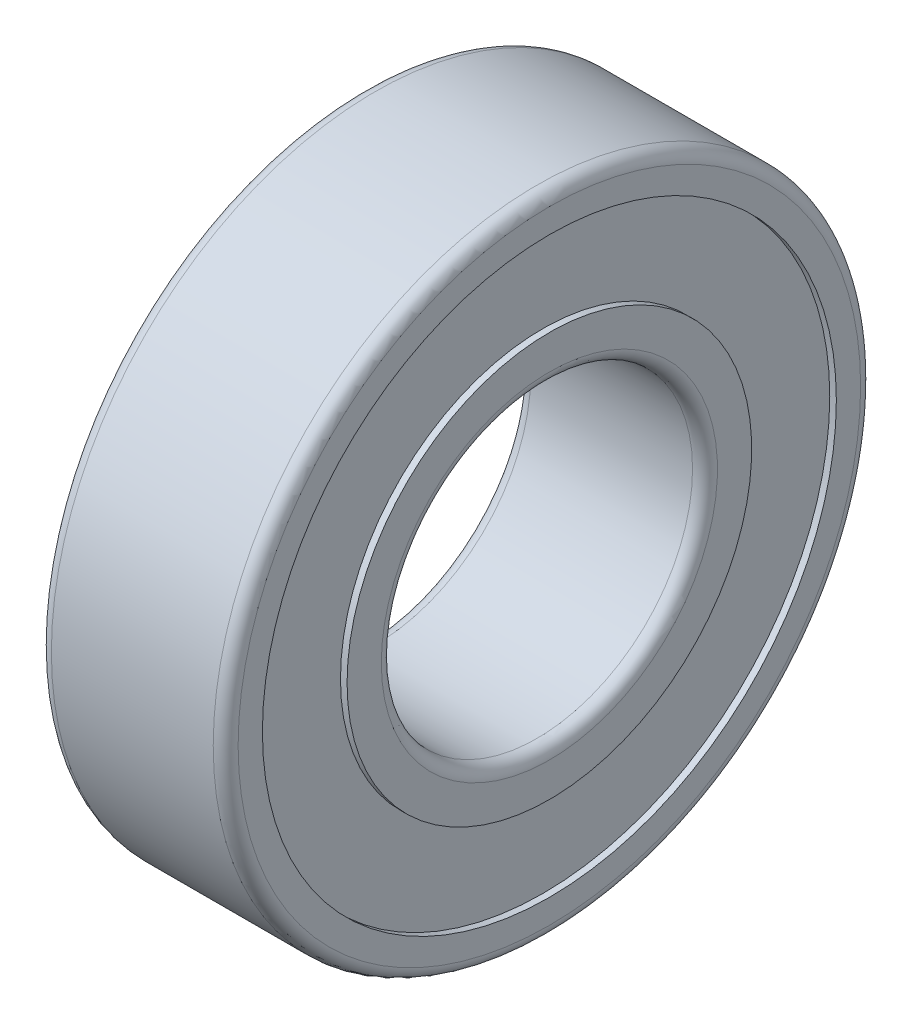
ISO-10303-21;
HEADER;
FILE_DESCRIPTION(('STEP AP214'),'2;1');
FILE_NAME('part.step','',(''),(''),'','','');
FILE_SCHEMA(('AUTOMOTIVE_DESIGN { 1 0 10303 214 1 1 1 1 }'));
ENDSEC;
DATA;
#1=APPLICATION_CONTEXT('core data for automotive mechanical design processes');
#2=APPLICATION_PROTOCOL_DEFINITION('international standard','automotive_design',2000,#1);
#3=PRODUCT_CONTEXT('',#1,'mechanical');
#4=PRODUCT('Part','Part','',(#3));
#5=PRODUCT_RELATED_PRODUCT_CATEGORY('part','',(#4));
#6=PRODUCT_DEFINITION_FORMATION('','',#4);
#7=PRODUCT_DEFINITION_CONTEXT('part definition',#1,'design');
#8=PRODUCT_DEFINITION('design','',#6,#7);
#9=PRODUCT_DEFINITION_SHAPE('','',#8);
#10=(LENGTH_UNIT() NAMED_UNIT(*) SI_UNIT(.MILLI.,.METRE.));
#11=(NAMED_UNIT(*) PLANE_ANGLE_UNIT() SI_UNIT($,.RADIAN.));
#12=(NAMED_UNIT(*) SI_UNIT($,.STERADIAN.) SOLID_ANGLE_UNIT());
#13=UNCERTAINTY_MEASURE_WITH_UNIT(LENGTH_MEASURE(1.E-05),#10,'distance_accuracy_value','');
#14=(GEOMETRIC_REPRESENTATION_CONTEXT(3) GLOBAL_UNCERTAINTY_ASSIGNED_CONTEXT((#13)) GLOBAL_UNIT_ASSIGNED_CONTEXT((#10,
#11,#12)) REPRESENTATION_CONTEXT('',''));
#15=CARTESIAN_POINT('',(0.,0.,0.));
#16=DIRECTION('',(0.,0.,1.));
#17=DIRECTION('',(1.,0.,0.));
#18=AXIS2_PLACEMENT_3D('',#15,#16,#17);
#19=CARTESIAN_POINT('',(0.999999999999219,0.,0.));
#20=DIRECTION('',(-1.,0.,0.));
#21=DIRECTION('',(0.,0.,1.));
#22=AXIS2_PLACEMENT_3D('',#19,#20,#21);
#23=TOROIDAL_SURFACE('',#22,25.0000000000008,0.999999999999218);
#24=CARTESIAN_POINT('',(0.,0.,0.));
#25=DIRECTION('',(-1.,0.,0.));
#26=DIRECTION('',(0.,0.,1.));
#27=AXIS2_PLACEMENT_3D('',#24,#25,#26);
#28=CIRCLE('',#27,25.);
#29=CARTESIAN_POINT('',(0.,0.,25.));
#30=VERTEX_POINT('',#29);
#31=EDGE_CURVE('E10',#30,#30,#28,.T.);
#32=ORIENTED_EDGE('',*,*,#31,.F.);
#33=EDGE_LOOP('',(#32));
#34=FACE_BOUND('',#33,.T.);
#35=CARTESIAN_POINT('',(1.,0.,0.));
#36=DIRECTION('',(-1.,0.,0.));
#37=DIRECTION('',(0.,0.,1.));
#38=AXIS2_PLACEMENT_3D('',#35,#36,#37);
#39=CIRCLE('',#38,26.);
#40=CARTESIAN_POINT('',(1.,0.,26.));
#41=VERTEX_POINT('',#40);
#42=EDGE_CURVE('E90',#41,#41,#39,.T.);
#43=ORIENTED_EDGE('',*,*,#42,.T.);
#44=EDGE_LOOP('',(#43));
#45=FACE_BOUND('',#44,.T.);
#46=ADVANCED_FACE('F40',(#34,#45),#23,.T.);
#47=CARTESIAN_POINT('',(0.,25.,0.));
#48=DIRECTION('',(1.,0.,0.));
#49=DIRECTION('',(0.,0.,-1.));
#50=AXIS2_PLACEMENT_3D('',#47,#48,#49);
#51=PLANE('',#50);
#52=CARTESIAN_POINT('',(0.,0.,0.));
#53=DIRECTION('',(-1.,0.,0.));
#54=DIRECTION('',(0.,0.,1.));
#55=AXIS2_PLACEMENT_3D('',#52,#53,#54);
#56=CIRCLE('',#55,23.05);
#57=CARTESIAN_POINT('',(0.,0.,23.05));
#58=VERTEX_POINT('',#57);
#59=EDGE_CURVE('E43',#58,#58,#56,.T.);
#60=ORIENTED_EDGE('',*,*,#59,.F.);
#61=EDGE_LOOP('',(#60));
#62=FACE_BOUND('',#61,.T.);
#63=ORIENTED_EDGE('',*,*,#31,.T.);
#64=EDGE_LOOP('',(#63));
#65=FACE_BOUND('',#64,.T.);
#66=ADVANCED_FACE('F171',(#62,#65),#51,.F.);
#67=CARTESIAN_POINT('',(15.,0.,0.));
#68=DIRECTION('',(-1.,0.,0.));
#69=DIRECTION('',(0.,0.,1.));
#70=AXIS2_PLACEMENT_3D('',#67,#68,#69);
#71=CYLINDRICAL_SURFACE('',#70,23.05);
#72=CARTESIAN_POINT('',(0.529999999999999,0.,0.));
#73=DIRECTION('',(-1.,0.,0.));
#74=DIRECTION('',(0.,0.,1.));
#75=AXIS2_PLACEMENT_3D('',#72,#73,#74);
#76=CIRCLE('',#75,23.05);
#77=CARTESIAN_POINT('',(0.529999999999999,0.,23.05));
#78=VERTEX_POINT('',#77);
#79=EDGE_CURVE('E50',#78,#78,#76,.T.);
#80=ORIENTED_EDGE('',*,*,#79,.F.);
#81=EDGE_LOOP('',(#80));
#82=FACE_BOUND('',#81,.T.);
#83=ORIENTED_EDGE('',*,*,#59,.T.);
#84=EDGE_LOOP('',(#83));
#85=FACE_BOUND('',#84,.T.);
#86=ADVANCED_FACE('F166',(#82,#85),#71,.F.);
#87=CARTESIAN_POINT('',(0.53,23.05,0.));
#88=DIRECTION('',(1.,0.,0.));
#89=DIRECTION('',(0.,0.,-1.));
#90=AXIS2_PLACEMENT_3D('',#87,#88,#89);
#91=PLANE('',#90);
#92=CARTESIAN_POINT('',(0.529999999999999,0.,0.));
#93=DIRECTION('',(-1.,0.,0.));
#94=DIRECTION('',(0.,0.,1.));
#95=AXIS2_PLACEMENT_3D('',#92,#93,#94);
#96=CIRCLE('',#95,16.25);
#97=CARTESIAN_POINT('',(0.529999999999999,0.,16.25));
#98=VERTEX_POINT('',#97);
#99=EDGE_CURVE('E51',#98,#98,#96,.T.);
#100=ORIENTED_EDGE('',*,*,#99,.F.);
#101=EDGE_LOOP('',(#100));
#102=FACE_BOUND('',#101,.T.);
#103=ORIENTED_EDGE('',*,*,#79,.T.);
#104=EDGE_LOOP('',(#103));
#105=FACE_BOUND('',#104,.T.);
#106=ADVANCED_FACE('F162',(#102,#105),#91,.F.);
#107=CARTESIAN_POINT('',(15.,0.,0.));
#108=DIRECTION('',(-1.,0.,0.));
#109=DIRECTION('',(0.,0.,1.));
#110=AXIS2_PLACEMENT_3D('',#107,#108,#109);
#111=CYLINDRICAL_SURFACE('',#110,16.25);
#112=CARTESIAN_POINT('',(0.,0.,0.));
#113=DIRECTION('',(-1.,0.,0.));
#114=DIRECTION('',(0.,0.,1.));
#115=AXIS2_PLACEMENT_3D('',#112,#113,#114);
#116=CIRCLE('',#115,16.25);
#117=CARTESIAN_POINT('',(0.,0.,16.25));
#118=VERTEX_POINT('',#117);
#119=EDGE_CURVE('E57',#118,#118,#116,.T.);
#120=ORIENTED_EDGE('',*,*,#119,.F.);
#121=EDGE_LOOP('',(#120));
#122=FACE_BOUND('',#121,.T.);
#123=ORIENTED_EDGE('',*,*,#99,.T.);
#124=EDGE_LOOP('',(#123));
#125=FACE_BOUND('',#124,.T.);
#126=ADVANCED_FACE('F160',(#122,#125),#111,.T.);
#127=CARTESIAN_POINT('',(0.,16.25,0.));
#128=DIRECTION('',(1.,0.,0.));
#129=DIRECTION('',(0.,0.,-1.));
#130=AXIS2_PLACEMENT_3D('',#127,#128,#129);
#131=PLANE('',#130);
#132=CARTESIAN_POINT('',(0.,0.,0.));
#133=DIRECTION('',(-1.,0.,0.));
#134=DIRECTION('',(0.,0.,1.));
#135=AXIS2_PLACEMENT_3D('',#132,#133,#134);
#136=CIRCLE('',#135,13.5);
#137=CARTESIAN_POINT('',(0.,0.,13.5));
#138=VERTEX_POINT('',#137);
#139=EDGE_CURVE('E56',#138,#138,#136,.T.);
#140=ORIENTED_EDGE('',*,*,#139,.F.);
#141=EDGE_LOOP('',(#140));
#142=FACE_BOUND('',#141,.T.);
#143=ORIENTED_EDGE('',*,*,#119,.T.);
#144=EDGE_LOOP('',(#143));
#145=FACE_BOUND('',#144,.T.);
#146=ADVANCED_FACE('F151',(#142,#145),#131,.F.);
#147=CARTESIAN_POINT('',(0.999999999999223,0.,0.));
#148=DIRECTION('',(-1.,0.,0.));
#149=DIRECTION('',(0.,0.,1.));
#150=AXIS2_PLACEMENT_3D('',#147,#148,#149);
#151=TOROIDAL_SURFACE('',#150,13.4999999999992,0.999999999999224);
#152=CARTESIAN_POINT('',(0.999999999999999,0.,0.));
#153=DIRECTION('',(-1.,0.,0.));
#154=DIRECTION('',(0.,0.,1.));
#155=AXIS2_PLACEMENT_3D('',#152,#153,#154);
#156=CIRCLE('',#155,12.5);
#157=CARTESIAN_POINT('',(0.999999999999999,0.,12.5));
#158=VERTEX_POINT('',#157);
#159=EDGE_CURVE('E65',#158,#158,#156,.T.);
#160=ORIENTED_EDGE('',*,*,#159,.F.);
#161=EDGE_LOOP('',(#160));
#162=FACE_BOUND('',#161,.T.);
#163=ORIENTED_EDGE('',*,*,#139,.T.);
#164=EDGE_LOOP('',(#163));
#165=FACE_BOUND('',#164,.T.);
#166=ADVANCED_FACE('F144',(#162,#165),#151,.T.);
#167=CARTESIAN_POINT('',(15.,0.,0.));
#168=DIRECTION('',(-1.,0.,0.));
#169=DIRECTION('',(0.,0.,1.));
#170=AXIS2_PLACEMENT_3D('',#167,#168,#169);
#171=CYLINDRICAL_SURFACE('',#170,12.5);
#172=CARTESIAN_POINT('',(14.,0.,0.));
#173=DIRECTION('',(-1.,0.,0.));
#174=DIRECTION('',(0.,0.,1.));
#175=AXIS2_PLACEMENT_3D('',#172,#173,#174);
#176=CIRCLE('',#175,12.5);
#177=CARTESIAN_POINT('',(14.,0.,12.5));
#178=VERTEX_POINT('',#177);
#179=EDGE_CURVE('E63',#178,#178,#176,.T.);
#180=ORIENTED_EDGE('',*,*,#179,.F.);
#181=EDGE_LOOP('',(#180));
#182=FACE_BOUND('',#181,.T.);
#183=ORIENTED_EDGE('',*,*,#159,.T.);
#184=EDGE_LOOP('',(#183));
#185=FACE_BOUND('',#184,.T.);
#186=ADVANCED_FACE('F137',(#182,#185),#171,.F.);
#187=CARTESIAN_POINT('',(14.0000000000015,0.,0.));
#188=DIRECTION('',(-1.,0.,0.));
#189=DIRECTION('',(0.,0.,1.));
#190=AXIS2_PLACEMENT_3D('',#187,#188,#189);
#191=TOROIDAL_SURFACE('',#190,13.4999999999985,0.999999999998455);
#192=CARTESIAN_POINT('',(15.,0.,0.));
#193=DIRECTION('',(-1.,0.,0.));
#194=DIRECTION('',(0.,0.,1.));
#195=AXIS2_PLACEMENT_3D('',#192,#193,#194);
#196=CIRCLE('',#195,13.5);
#197=CARTESIAN_POINT('',(15.,0.,13.5));
#198=VERTEX_POINT('',#197);
#199=EDGE_CURVE('E69',#198,#198,#196,.T.);
#200=ORIENTED_EDGE('',*,*,#199,.F.);
#201=EDGE_LOOP('',(#200));
#202=FACE_BOUND('',#201,.T.);
#203=ORIENTED_EDGE('',*,*,#179,.T.);
#204=EDGE_LOOP('',(#203));
#205=FACE_BOUND('',#204,.T.);
#206=ADVANCED_FACE('F134',(#202,#205),#191,.T.);
#207=CARTESIAN_POINT('',(15.,13.5,0.));
#208=DIRECTION('',(-1.,0.,0.));
#209=DIRECTION('',(0.,0.,1.));
#210=AXIS2_PLACEMENT_3D('',#207,#208,#209);
#211=PLANE('',#210);
#212=CARTESIAN_POINT('',(15.,0.,0.));
#213=DIRECTION('',(-1.,0.,0.));
#214=DIRECTION('',(0.,0.,1.));
#215=AXIS2_PLACEMENT_3D('',#212,#213,#214);
#216=CIRCLE('',#215,16.25);
#217=CARTESIAN_POINT('',(15.,0.,16.25));
#218=VERTEX_POINT('',#217);
#219=EDGE_CURVE('E72',#218,#218,#216,.T.);
#220=ORIENTED_EDGE('',*,*,#219,.F.);
#221=EDGE_LOOP('',(#220));
#222=FACE_BOUND('',#221,.T.);
#223=ORIENTED_EDGE('',*,*,#199,.T.);
#224=EDGE_LOOP('',(#223));
#225=FACE_BOUND('',#224,.T.);
#226=ADVANCED_FACE('F130',(#222,#225),#211,.F.);
#227=CARTESIAN_POINT('',(15.,0.,0.));
#228=DIRECTION('',(-1.,0.,0.));
#229=DIRECTION('',(0.,0.,1.));
#230=AXIS2_PLACEMENT_3D('',#227,#228,#229);
#231=CYLINDRICAL_SURFACE('',#230,16.25);
#232=CARTESIAN_POINT('',(14.47,0.,0.));
#233=DIRECTION('',(-1.,0.,0.));
#234=DIRECTION('',(0.,0.,1.));
#235=AXIS2_PLACEMENT_3D('',#232,#233,#234);
#236=CIRCLE('',#235,16.25);
#237=CARTESIAN_POINT('',(14.47,0.,16.25));
#238=VERTEX_POINT('',#237);
#239=EDGE_CURVE('E74',#238,#238,#236,.T.);
#240=ORIENTED_EDGE('',*,*,#239,.F.);
#241=EDGE_LOOP('',(#240));
#242=FACE_BOUND('',#241,.T.);
#243=ORIENTED_EDGE('',*,*,#219,.T.);
#244=EDGE_LOOP('',(#243));
#245=FACE_BOUND('',#244,.T.);
#246=ADVANCED_FACE('F122',(#242,#245),#231,.T.);
#247=CARTESIAN_POINT('',(14.47,16.25,0.));
#248=DIRECTION('',(-1.,0.,0.));
#249=DIRECTION('',(0.,0.,1.));
#250=AXIS2_PLACEMENT_3D('',#247,#248,#249);
#251=PLANE('',#250);
#252=CARTESIAN_POINT('',(14.47,0.,0.));
#253=DIRECTION('',(-1.,0.,0.));
#254=DIRECTION('',(0.,0.,1.));
#255=AXIS2_PLACEMENT_3D('',#252,#253,#254);
#256=CIRCLE('',#255,23.05);
#257=CARTESIAN_POINT('',(14.47,0.,23.05));
#258=VERTEX_POINT('',#257);
#259=EDGE_CURVE('E80',#258,#258,#256,.T.);
#260=ORIENTED_EDGE('',*,*,#259,.F.);
#261=EDGE_LOOP('',(#260));
#262=FACE_BOUND('',#261,.T.);
#263=ORIENTED_EDGE('',*,*,#239,.T.);
#264=EDGE_LOOP('',(#263));
#265=FACE_BOUND('',#264,.T.);
#266=ADVANCED_FACE('F113',(#262,#265),#251,.F.);
#267=CARTESIAN_POINT('',(15.,0.,0.));
#268=DIRECTION('',(-1.,0.,0.));
#269=DIRECTION('',(0.,0.,1.));
#270=AXIS2_PLACEMENT_3D('',#267,#268,#269);
#271=CYLINDRICAL_SURFACE('',#270,23.05);
#272=CARTESIAN_POINT('',(15.,0.,0.));
#273=DIRECTION('',(-1.,0.,0.));
#274=DIRECTION('',(0.,0.,1.));
#275=AXIS2_PLACEMENT_3D('',#272,#273,#274);
#276=CIRCLE('',#275,23.05);
#277=CARTESIAN_POINT('',(15.,0.,23.05));
#278=VERTEX_POINT('',#277);
#279=EDGE_CURVE('E78',#278,#278,#276,.T.);
#280=ORIENTED_EDGE('',*,*,#279,.F.);
#281=EDGE_LOOP('',(#280));
#282=FACE_BOUND('',#281,.T.);
#283=ORIENTED_EDGE('',*,*,#259,.T.);
#284=EDGE_LOOP('',(#283));
#285=FACE_BOUND('',#284,.T.);
#286=ADVANCED_FACE('F108',(#282,#285),#271,.F.);
#287=CARTESIAN_POINT('',(15.,23.05,0.));
#288=DIRECTION('',(-1.,0.,0.));
#289=DIRECTION('',(0.,0.,1.));
#290=AXIS2_PLACEMENT_3D('',#287,#288,#289);
#291=PLANE('',#290);
#292=CARTESIAN_POINT('',(15.,0.,0.));
#293=DIRECTION('',(-1.,0.,0.));
#294=DIRECTION('',(0.,0.,1.));
#295=AXIS2_PLACEMENT_3D('',#292,#293,#294);
#296=CIRCLE('',#295,25.);
#297=CARTESIAN_POINT('',(15.,0.,25.));
#298=VERTEX_POINT('',#297);
#299=EDGE_CURVE('E83',#298,#298,#296,.T.);
#300=ORIENTED_EDGE('',*,*,#299,.F.);
#301=EDGE_LOOP('',(#300));
#302=FACE_BOUND('',#301,.T.);
#303=ORIENTED_EDGE('',*,*,#279,.T.);
#304=EDGE_LOOP('',(#303));
#305=FACE_BOUND('',#304,.T.);
#306=ADVANCED_FACE('F103',(#302,#305),#291,.F.);
#307=CARTESIAN_POINT('',(14.0000000000015,0.,0.));
#308=DIRECTION('',(-1.,0.,0.));
#309=DIRECTION('',(0.,0.,1.));
#310=AXIS2_PLACEMENT_3D('',#307,#308,#309);
#311=TOROIDAL_SURFACE('',#310,25.0000000000015,0.99999999999845);
#312=CARTESIAN_POINT('',(14.,0.,0.));
#313=DIRECTION('',(-1.,0.,0.));
#314=DIRECTION('',(0.,0.,1.));
#315=AXIS2_PLACEMENT_3D('',#312,#313,#314);
#316=CIRCLE('',#315,26.);
#317=CARTESIAN_POINT('',(14.,0.,26.));
#318=VERTEX_POINT('',#317);
#319=EDGE_CURVE('E88',#318,#318,#316,.T.);
#320=ORIENTED_EDGE('',*,*,#319,.F.);
#321=EDGE_LOOP('',(#320));
#322=FACE_BOUND('',#321,.T.);
#323=ORIENTED_EDGE('',*,*,#299,.T.);
#324=EDGE_LOOP('',(#323));
#325=FACE_BOUND('',#324,.T.);
#326=ADVANCED_FACE('F100',(#322,#325),#311,.T.);
#327=CARTESIAN_POINT('',(15.,0.,0.));
#328=DIRECTION('',(-1.,0.,0.));
#329=DIRECTION('',(0.,0.,1.));
#330=AXIS2_PLACEMENT_3D('',#327,#328,#329);
#331=CYLINDRICAL_SURFACE('',#330,26.);
#332=ORIENTED_EDGE('',*,*,#42,.F.);
#333=EDGE_LOOP('',(#332));
#334=FACE_BOUND('',#333,.T.);
#335=ORIENTED_EDGE('',*,*,#319,.T.);
#336=EDGE_LOOP('',(#335));
#337=FACE_BOUND('',#336,.T.);
#338=ADVANCED_FACE('F94',(#334,#337),#331,.T.);
#339=CLOSED_SHELL('',(#46,#66,#86,#106,#126,#146,#166,#186,#206,#226,#246,#266,#286,#306,#326,#338));
#340=MANIFOLD_SOLID_BREP('B2',#339);
#341=ADVANCED_BREP_SHAPE_REPRESENTATION('',(#18,#340),#14);
#342=SHAPE_DEFINITION_REPRESENTATION(#9,#341);
ENDSEC;
END-ISO-10303-21;
